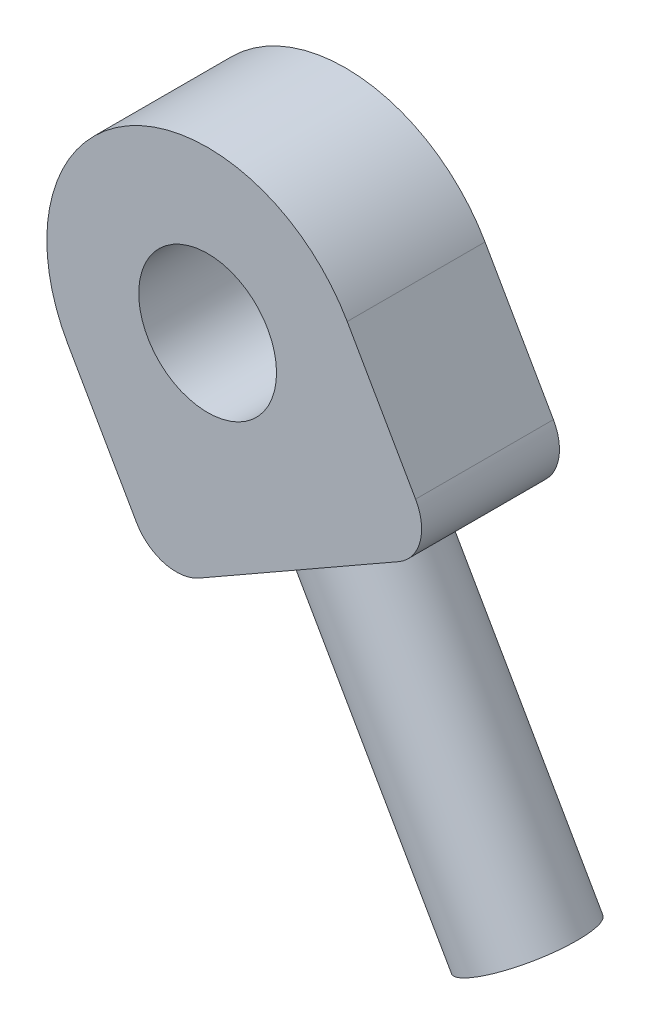
ISO-10303-21;
HEADER;
FILE_DESCRIPTION(('STEP AP214'),'2;1');
FILE_NAME('part.step','',(''),(''),'','','');
FILE_SCHEMA(('AUTOMOTIVE_DESIGN { 1 0 10303 214 1 1 1 1 }'));
ENDSEC;
DATA;
#1=APPLICATION_CONTEXT('core data for automotive mechanical design processes');
#2=APPLICATION_PROTOCOL_DEFINITION('international standard','automotive_design',2000,#1);
#3=PRODUCT_CONTEXT('',#1,'mechanical');
#4=PRODUCT('Part','Part','',(#3));
#5=PRODUCT_RELATED_PRODUCT_CATEGORY('part','',(#4));
#6=PRODUCT_DEFINITION_FORMATION('','',#4);
#7=PRODUCT_DEFINITION_CONTEXT('part definition',#1,'design');
#8=PRODUCT_DEFINITION('design','',#6,#7);
#9=PRODUCT_DEFINITION_SHAPE('','',#8);
#10=(LENGTH_UNIT() NAMED_UNIT(*) SI_UNIT(.MILLI.,.METRE.));
#11=(NAMED_UNIT(*) PLANE_ANGLE_UNIT() SI_UNIT($,.RADIAN.));
#12=(NAMED_UNIT(*) SI_UNIT($,.STERADIAN.) SOLID_ANGLE_UNIT());
#13=UNCERTAINTY_MEASURE_WITH_UNIT(LENGTH_MEASURE(1.E-05),#10,'distance_accuracy_value','');
#14=(GEOMETRIC_REPRESENTATION_CONTEXT(3) GLOBAL_UNCERTAINTY_ASSIGNED_CONTEXT((#13)) GLOBAL_UNIT_ASSIGNED_CONTEXT((#10,
#11,#12)) REPRESENTATION_CONTEXT('',''));
#15=CARTESIAN_POINT('',(0.,0.,0.));
#16=DIRECTION('',(0.,0.,1.));
#17=DIRECTION('',(1.,0.,0.));
#18=AXIS2_PLACEMENT_3D('',#15,#16,#17);
#19=CARTESIAN_POINT('',(20.,15.,3.));
#20=DIRECTION('',(0.,0.,1.));
#21=DIRECTION('',(1.,0.,0.));
#22=AXIS2_PLACEMENT_3D('',#19,#20,#21);
#23=PLANE('',#22);
#24=DIRECTION('',(0.496138938356834,-0.868243142124459,0.));
#25=VECTOR('',#24,1.);
#26=CARTESIAN_POINT('',(13.9222980051288,11.5270274315022,3.));
#27=LINE('',#26,#25);
#28=CARTESIAN_POINT('',(13.9222980051288,11.5270274315022,3.));
#29=VERTEX_POINT('',#28);
#30=CARTESIAN_POINT('',(16.8991316352698,6.31756857875541,3.));
#31=VERTEX_POINT('',#30);
#32=EDGE_CURVE('E92',#29,#31,#27,.T.);
#33=ORIENTED_EDGE('',*,*,#32,.T.);
#34=CARTESIAN_POINT('',(18.6356179195187,7.30984645546908,3.));
#35=DIRECTION('',(0.,0.,1.));
#36=DIRECTION('',(1.,0.,0.));
#37=AXIS2_PLACEMENT_3D('',#34,#35,#36);
#38=CIRCLE('',#37,2.);
#39=CARTESIAN_POINT('',(19.6278957962324,5.57336017122016,3.));
#40=VERTEX_POINT('',#39);
#41=EDGE_CURVE('E25',#31,#40,#38,.T.);
#42=ORIENTED_EDGE('',*,*,#41,.T.);
#43=DIRECTION('',(0.868243142124459,0.496138938356834,0.));
#44=VECTOR('',#43,1.);
#45=CARTESIAN_POINT('',(17.8914095119835,4.58108229450649,3.));
#46=LINE('',#45,#44);
#47=CARTESIAN_POINT('',(28.3103272174769,10.5347495547885,3.));
#48=VERTEX_POINT('',#47);
#49=EDGE_CURVE('E78',#40,#48,#46,.T.);
#50=ORIENTED_EDGE('',*,*,#49,.T.);
#51=CARTESIAN_POINT('',(27.3180493407633,12.2712358390374,3.));
#52=DIRECTION('',(0.,0.,1.));
#53=DIRECTION('',(1.,0.,0.));
#54=AXIS2_PLACEMENT_3D('',#51,#52,#53);
#55=CIRCLE('',#54,2.);
#56=CARTESIAN_POINT('',(29.0545356250122,13.2635137157511,3.));
#57=VERTEX_POINT('',#56);
#58=EDGE_CURVE('E32',#48,#57,#55,.T.);
#59=ORIENTED_EDGE('',*,*,#58,.T.);
#60=DIRECTION('',(-0.496138938356834,0.868243142124459,0.));
#61=VECTOR('',#60,1.);
#62=CARTESIAN_POINT('',(30.0468135017259,11.5270274315022,3.));
#63=LINE('',#62,#61);
#64=CARTESIAN_POINT('',(26.0777019948712,18.4729725684979,3.));
#65=VERTEX_POINT('',#64);
#66=EDGE_CURVE('E70',#57,#65,#63,.T.);
#67=ORIENTED_EDGE('',*,*,#66,.T.);
#68=CARTESIAN_POINT('',(20.,15.,3.));
#69=DIRECTION('',(0.,0.,1.));
#70=DIRECTION('',(1.,0.,0.));
#71=AXIS2_PLACEMENT_3D('',#68,#69,#70);
#72=CIRCLE('',#71,7.);
#73=EDGE_CURVE('E74',#65,#29,#72,.T.);
#74=ORIENTED_EDGE('',*,*,#73,.T.);
#75=EDGE_LOOP('',(#33,#42,#50,#59,#67,#74));
#76=FACE_BOUND('',#75,.T.);
#77=CARTESIAN_POINT('',(20.,15.,3.));
#78=DIRECTION('',(0.,0.,1.));
#79=DIRECTION('',(1.,0.,0.));
#80=AXIS2_PLACEMENT_3D('',#77,#78,#79);
#81=CIRCLE('',#80,3.);
#82=CARTESIAN_POINT('',(23.,15.,3.));
#83=VERTEX_POINT('',#82);
#84=EDGE_CURVE('E100',#83,#83,#81,.T.);
#85=ORIENTED_EDGE('',*,*,#84,.F.);
#86=EDGE_LOOP('',(#85));
#87=FACE_BOUND('',#86,.T.);
#88=ADVANCED_FACE('F17',(#76,#87),#23,.T.);
#89=CARTESIAN_POINT('',(20.,15.,-3.));
#90=DIRECTION('',(0.,0.,1.));
#91=DIRECTION('',(1.,0.,0.));
#92=AXIS2_PLACEMENT_3D('',#89,#90,#91);
#93=PLANE('',#92);
#94=DIRECTION('',(0.868243142124459,0.496138938356834,0.));
#95=VECTOR('',#94,1.);
#96=CARTESIAN_POINT('',(17.8914095119835,4.58108229450649,-3.));
#97=LINE('',#96,#95);
#98=CARTESIAN_POINT('',(19.6278957962324,5.57336017122016,-3.));
#99=VERTEX_POINT('',#98);
#100=CARTESIAN_POINT('',(28.3103272174769,10.5347495547885,-3.));
#101=VERTEX_POINT('',#100);
#102=EDGE_CURVE('E97',#99,#101,#97,.T.);
#103=ORIENTED_EDGE('',*,*,#102,.F.);
#104=CARTESIAN_POINT('',(18.6356179195187,7.30984645546908,-3.));
#105=DIRECTION('',(0.,0.,1.));
#106=DIRECTION('',(1.,0.,0.));
#107=AXIS2_PLACEMENT_3D('',#104,#105,#106);
#108=CIRCLE('',#107,2.);
#109=CARTESIAN_POINT('',(16.8991316352698,6.31756857875541,-3.));
#110=VERTEX_POINT('',#109);
#111=EDGE_CURVE('E114',#99,#110,#108,.F.);
#112=ORIENTED_EDGE('',*,*,#111,.T.);
#113=DIRECTION('',(0.496138938356834,-0.868243142124459,0.));
#114=VECTOR('',#113,1.);
#115=CARTESIAN_POINT('',(13.9222980051288,11.5270274315022,-3.));
#116=LINE('',#115,#114);
#117=CARTESIAN_POINT('',(13.9222980051288,11.5270274315022,-3.));
#118=VERTEX_POINT('',#117);
#119=EDGE_CURVE('E104',#118,#110,#116,.T.);
#120=ORIENTED_EDGE('',*,*,#119,.F.);
#121=CARTESIAN_POINT('',(20.,15.,-3.));
#122=DIRECTION('',(0.,0.,1.));
#123=DIRECTION('',(1.,0.,0.));
#124=AXIS2_PLACEMENT_3D('',#121,#122,#123);
#125=CIRCLE('',#124,7.);
#126=CARTESIAN_POINT('',(26.0777019948712,18.4729725684979,-3.));
#127=VERTEX_POINT('',#126);
#128=EDGE_CURVE('E102',#127,#118,#125,.T.);
#129=ORIENTED_EDGE('',*,*,#128,.F.);
#130=DIRECTION('',(-0.496138938356834,0.868243142124459,0.));
#131=VECTOR('',#130,1.);
#132=CARTESIAN_POINT('',(30.0468135017259,11.5270274315022,-3.));
#133=LINE('',#132,#131);
#134=CARTESIAN_POINT('',(29.0545356250122,13.2635137157511,-3.));
#135=VERTEX_POINT('',#134);
#136=EDGE_CURVE('E84',#135,#127,#133,.T.);
#137=ORIENTED_EDGE('',*,*,#136,.F.);
#138=CARTESIAN_POINT('',(27.3180493407633,12.2712358390374,-3.));
#139=DIRECTION('',(0.,0.,1.));
#140=DIRECTION('',(1.,0.,0.));
#141=AXIS2_PLACEMENT_3D('',#138,#139,#140);
#142=CIRCLE('',#141,2.);
#143=EDGE_CURVE('E112',#135,#101,#142,.F.);
#144=ORIENTED_EDGE('',*,*,#143,.T.);
#145=EDGE_LOOP('',(#103,#112,#120,#129,#137,#144));
#146=FACE_BOUND('',#145,.T.);
#147=CARTESIAN_POINT('',(20.,15.,-3.));
#148=DIRECTION('',(0.,0.,1.));
#149=DIRECTION('',(1.,0.,0.));
#150=AXIS2_PLACEMENT_3D('',#147,#148,#149);
#151=CIRCLE('',#150,3.);
#152=CARTESIAN_POINT('',(23.,15.,-3.));
#153=VERTEX_POINT('',#152);
#154=EDGE_CURVE('E162',#153,#153,#151,.T.);
#155=ORIENTED_EDGE('',*,*,#154,.T.);
#156=EDGE_LOOP('',(#155));
#157=FACE_BOUND('',#156,.T.);
#158=ADVANCED_FACE('F128',(#146,#157),#93,.F.);
#159=CARTESIAN_POINT('',(17.8914095119835,4.58108229450649,3.));
#160=DIRECTION('',(-0.496138938356834,0.868243142124459,0.));
#161=DIRECTION('',(-0.868243142124459,-0.496138938356834,0.));
#162=AXIS2_PLACEMENT_3D('',#159,#160,#161);
#163=PLANE('',#162);
#164=CARTESIAN_POINT('',(23.9691115068547,8.05405486300433,0.));
#165=DIRECTION('',(0.496138938356834,-0.868243142124459,0.));
#166=DIRECTION('',(0.868243142124459,0.496138938356834,0.));
#167=AXIS2_PLACEMENT_3D('',#164,#165,#166);
#168=CIRCLE('',#167,2.5);
#169=CARTESIAN_POINT('',(21.7985036515435,6.81370751711223,0.));
#170=VERTEX_POINT('',#169);
#171=EDGE_CURVE('E87',#170,#170,#168,.T.);
#172=ORIENTED_EDGE('',*,*,#171,.F.);
#173=EDGE_LOOP('',(#172));
#174=FACE_BOUND('',#173,.T.);
#175=ORIENTED_EDGE('',*,*,#49,.F.);
#176=DIRECTION('',(0.,0.,-1.));
#177=VECTOR('',#176,1.);
#178=CARTESIAN_POINT('',(19.6278957962324,5.57336017122016,3.));
#179=LINE('',#178,#177);
#180=EDGE_CURVE('E109',#40,#99,#179,.T.);
#181=ORIENTED_EDGE('',*,*,#180,.T.);
#182=ORIENTED_EDGE('',*,*,#102,.T.);
#183=DIRECTION('',(0.,0.,-1.));
#184=VECTOR('',#183,1.);
#185=CARTESIAN_POINT('',(28.3103272174769,10.5347495547885,3.));
#186=LINE('',#185,#184);
#187=EDGE_CURVE('E107',#101,#48,#186,.F.);
#188=ORIENTED_EDGE('',*,*,#187,.T.);
#189=EDGE_LOOP('',(#175,#181,#182,#188));
#190=FACE_BOUND('',#189,.T.);
#191=ADVANCED_FACE('F122',(#174,#190),#163,.F.);
#192=CARTESIAN_POINT('',(30.0468135017259,11.5270274315022,3.));
#193=DIRECTION('',(-0.868243142124459,-0.496138938356834,0.));
#194=DIRECTION('',(0.496138938356834,-0.868243142124459,0.));
#195=AXIS2_PLACEMENT_3D('',#192,#193,#194);
#196=PLANE('',#195);
#197=ORIENTED_EDGE('',*,*,#66,.F.);
#198=DIRECTION('',(0.,0.,-1.));
#199=VECTOR('',#198,1.);
#200=CARTESIAN_POINT('',(29.0545356250122,13.2635137157511,3.));
#201=LINE('',#200,#199);
#202=EDGE_CURVE('E11',#57,#135,#201,.T.);
#203=ORIENTED_EDGE('',*,*,#202,.T.);
#204=ORIENTED_EDGE('',*,*,#136,.T.);
#205=DIRECTION('',(0.,0.,-1.));
#206=VECTOR('',#205,1.);
#207=CARTESIAN_POINT('',(26.0777019948712,18.4729725684979,3.));
#208=LINE('',#207,#206);
#209=EDGE_CURVE('E81',#65,#127,#208,.T.);
#210=ORIENTED_EDGE('',*,*,#209,.F.);
#211=EDGE_LOOP('',(#197,#203,#204,#210));
#212=FACE_BOUND('',#211,.T.);
#213=ADVANCED_FACE('F82',(#212),#196,.F.);
#214=CARTESIAN_POINT('',(20.,15.,3.));
#215=DIRECTION('',(0.,0.,-1.));
#216=DIRECTION('',(-1.,0.,0.));
#217=AXIS2_PLACEMENT_3D('',#214,#215,#216);
#218=CYLINDRICAL_SURFACE('',#217,7.);
#219=ORIENTED_EDGE('',*,*,#128,.T.);
#220=DIRECTION('',(0.,0.,-1.));
#221=VECTOR('',#220,1.);
#222=CARTESIAN_POINT('',(13.9222980051288,11.5270274315022,3.));
#223=LINE('',#222,#221);
#224=EDGE_CURVE('E88',#29,#118,#223,.T.);
#225=ORIENTED_EDGE('',*,*,#224,.F.);
#226=ORIENTED_EDGE('',*,*,#73,.F.);
#227=ORIENTED_EDGE('',*,*,#209,.T.);
#228=EDGE_LOOP('',(#219,#225,#226,#227));
#229=FACE_BOUND('',#228,.T.);
#230=ADVANCED_FACE('F90',(#229),#218,.T.);
#231=CARTESIAN_POINT('',(13.9222980051288,11.5270274315022,3.));
#232=DIRECTION('',(0.868243142124459,0.496138938356834,0.));
#233=DIRECTION('',(-0.496138938356834,0.868243142124459,0.));
#234=AXIS2_PLACEMENT_3D('',#231,#232,#233);
#235=PLANE('',#234);
#236=ORIENTED_EDGE('',*,*,#119,.T.);
#237=DIRECTION('',(0.,0.,-1.));
#238=VECTOR('',#237,1.);
#239=CARTESIAN_POINT('',(16.8991316352698,6.31756857875541,3.));
#240=LINE('',#239,#238);
#241=EDGE_CURVE('E40',#110,#31,#240,.F.);
#242=ORIENTED_EDGE('',*,*,#241,.T.);
#243=ORIENTED_EDGE('',*,*,#32,.F.);
#244=ORIENTED_EDGE('',*,*,#224,.T.);
#245=EDGE_LOOP('',(#236,#242,#243,#244));
#246=FACE_BOUND('',#245,.T.);
#247=ADVANCED_FACE('F130',(#246),#235,.F.);
#248=CARTESIAN_POINT('',(20.,15.,3.));
#249=DIRECTION('',(0.,0.,-1.));
#250=DIRECTION('',(-1.,0.,0.));
#251=AXIS2_PLACEMENT_3D('',#248,#249,#250);
#252=CYLINDRICAL_SURFACE('',#251,3.);
#253=ORIENTED_EDGE('',*,*,#84,.T.);
#254=EDGE_LOOP('',(#253));
#255=FACE_BOUND('',#254,.T.);
#256=ORIENTED_EDGE('',*,*,#154,.F.);
#257=EDGE_LOOP('',(#256));
#258=FACE_BOUND('',#257,.T.);
#259=ADVANCED_FACE('F132',(#255,#258),#252,.F.);
#260=CARTESIAN_POINT('',(30.9150566438504,-4.1013491267381,0.));
#261=DIRECTION('',(-0.496138938356834,0.868243142124459,0.));
#262=DIRECTION('',(-0.868243142124459,-0.496138938356834,0.));
#263=AXIS2_PLACEMENT_3D('',#260,#261,#262);
#264=CYLINDRICAL_SURFACE('',#263,2.5);
#265=CARTESIAN_POINT('',(30.9150566438504,-4.1013491267381,0.));
#266=DIRECTION('',(0.496138938356834,-0.868243142124459,0.));
#267=DIRECTION('',(0.868243142124459,0.496138938356834,0.));
#268=AXIS2_PLACEMENT_3D('',#265,#266,#267);
#269=CIRCLE('',#268,2.5);
#270=CARTESIAN_POINT('',(28.7444487885392,-5.34169647263018,0.));
#271=VERTEX_POINT('',#270);
#272=EDGE_CURVE('E161',#271,#271,#269,.T.);
#273=CARTESIAN_POINT('',(28.7444487885392,-5.34169647263018,0.));
#274=CARTESIAN_POINT('',(28.6720951933622,-5.21507768107036,0.));
#275=CARTESIAN_POINT('',(28.5997415981851,-5.08845888951054,0.));
#276=CARTESIAN_POINT('',(28.4550344078311,-4.83522130639091,0.));
#277=CARTESIAN_POINT('',(28.382680812654,-4.7086025148311,0.));
#278=CARTESIAN_POINT('',(28.2379736222999,-4.45536493171146,0.));
#279=CARTESIAN_POINT('',(28.1656200271229,-4.32874614015164,0.));
#280=CARTESIAN_POINT('',(28.0209128367688,-4.07550855703201,0.));
#281=CARTESIAN_POINT('',(27.9485592415918,-3.94888976547219,0.));
#282=CARTESIAN_POINT('',(27.8038520512377,-3.69565218235256,0.));
#283=CARTESIAN_POINT('',(27.7314984560607,-3.56903339079274,0.));
#284=CARTESIAN_POINT('',(27.5867912657066,-3.31579580767311,0.));
#285=CARTESIAN_POINT('',(27.5144376705296,-3.18917701611329,0.));
#286=CARTESIAN_POINT('',(27.3697304801755,-2.93593943299366,0.));
#287=CARTESIAN_POINT('',(27.2973768849984,-2.80932064143384,0.));
#288=CARTESIAN_POINT('',(27.1526696946444,-2.55608305831421,0.));
#289=CARTESIAN_POINT('',(27.0803160994673,-2.42946426675439,0.));
#290=CARTESIAN_POINT('',(26.9356089091132,-2.17622668363476,0.));
#291=CARTESIAN_POINT('',(26.8632553139362,-2.04960789207494,0.));
#292=CARTESIAN_POINT('',(26.7185481235821,-1.79637030895531,0.));
#293=CARTESIAN_POINT('',(26.6461945284051,-1.66975151739549,0.));
#294=CARTESIAN_POINT('',(26.501487338051,-1.41651393427586,0.));
#295=CARTESIAN_POINT('',(26.429133742874,-1.28989514271604,0.));
#296=CARTESIAN_POINT('',(26.2844265525199,-1.03665755959641,0.));
#297=CARTESIAN_POINT('',(26.2120729573429,-0.910038768036591,0.));
#298=CARTESIAN_POINT('',(26.0673657669888,-0.656801184916957,0.));
#299=CARTESIAN_POINT('',(25.9950121718118,-0.530182393357141,0.));
#300=CARTESIAN_POINT('',(25.8503049814577,-0.276944810237507,0.));
#301=CARTESIAN_POINT('',(25.7779513862806,-0.15032601867769,0.));
#302=CARTESIAN_POINT('',(25.6332441959266,0.102911564441944,0.));
#303=CARTESIAN_POINT('',(25.5608906007495,0.229530356001761,0.));
#304=CARTESIAN_POINT('',(25.4161834103954,0.482767939121395,0.));
#305=CARTESIAN_POINT('',(25.3438298152184,0.609386730681211,0.));
#306=CARTESIAN_POINT('',(25.1991226248643,0.862624313800844,0.));
#307=CARTESIAN_POINT('',(25.1267690296873,0.989243105360661,0.));
#308=CARTESIAN_POINT('',(24.9820618393332,1.2424806884803,0.));
#309=CARTESIAN_POINT('',(24.9097082441562,1.36909948004011,0.));
#310=CARTESIAN_POINT('',(24.7650010538021,1.62233706315975,0.));
#311=CARTESIAN_POINT('',(24.6926474586251,1.74895585471956,0.));
#312=CARTESIAN_POINT('',(24.547940268271,2.0021934378392,0.));
#313=CARTESIAN_POINT('',(24.475586673094,2.12881222939901,0.));
#314=CARTESIAN_POINT('',(24.3308794827399,2.38204981251865,0.));
#315=CARTESIAN_POINT('',(24.2585258875628,2.50866860407846,0.));
#316=CARTESIAN_POINT('',(24.1138186972088,2.7619061871981,0.));
#317=CARTESIAN_POINT('',(24.0414651020317,2.88852497875791,0.));
#318=CARTESIAN_POINT('',(23.8967579116776,3.14176256187755,0.));
#319=CARTESIAN_POINT('',(23.8244043165006,3.26838135343736,0.));
#320=CARTESIAN_POINT('',(23.6796971261465,3.521618936557,0.));
#321=CARTESIAN_POINT('',(23.6073435309695,3.64823772811681,0.));
#322=CARTESIAN_POINT('',(23.4626363406154,3.90147531123645,0.));
#323=CARTESIAN_POINT('',(23.3902827454384,4.02809410279627,0.));
#324=CARTESIAN_POINT('',(23.2455755550843,4.2813316859159,0.));
#325=CARTESIAN_POINT('',(23.1732219599073,4.40795047747572,0.));
#326=CARTESIAN_POINT('',(23.0285147695532,4.66118806059535,0.));
#327=CARTESIAN_POINT('',(22.9561611743761,4.78780685215517,0.));
#328=CARTESIAN_POINT('',(22.8114539840221,5.0410444352748,0.));
#329=CARTESIAN_POINT('',(22.739100388845,5.16766322683462,0.));
#330=CARTESIAN_POINT('',(22.594393198491,5.42090080995425,0.));
#331=CARTESIAN_POINT('',(22.5220396033139,5.54751960151407,0.));
#332=CARTESIAN_POINT('',(22.3773324129598,5.8007571846337,0.));
#333=CARTESIAN_POINT('',(22.3049788177828,5.92737597619352,0.));
#334=CARTESIAN_POINT('',(22.1602716274287,6.18061355931315,0.));
#335=CARTESIAN_POINT('',(22.0879180322517,6.30723235087297,0.));
#336=CARTESIAN_POINT('',(21.9432108418976,6.5604699339926,0.));
#337=CARTESIAN_POINT('',(21.8708572467206,6.68708872555242,0.));
#338=CARTESIAN_POINT('',(21.7985036515435,6.81370751711223,0.));
#339=B_SPLINE_CURVE_WITH_KNOTS('',3,(#273,#274,#275,#276,#277,#278,#279,#280,#281,#282,#283,
#284,#285,#286,#287,#288,#289,#290,#291,#292,#293,#294,#295,#296,#297,#298,#299,#300,#301,#302,
#303,#304,#305,#306,#307,#308,#309,#310,#311,#312,#313,#314,#315,#316,#317,#318,#319,#320,#321,
#322,#323,#324,#325,#326,#327,#328,#329,#330,#331,#332,#333,#334,#335,#336,#337,#338),
.UNSPECIFIED.,.F.,.F.,(4,2,2,2,2,2,2,2,2,2,2,2,2,2,2,2,2,2,2,2,2,2,2,2,2,2,2,2,2,2,2,2,4),(0.,
0.437499999999999,0.875,1.3125,1.75,2.1875,2.625,3.0625,3.5,3.9375,4.375,4.8125,
5.24999999999999,5.68749999999999,6.12499999999999,6.56249999999999,6.99999999999999,
7.43749999999999,7.87499999999999,8.31249999999999,8.74999999999999,9.18749999999999,
9.62499999999999,10.0625,10.5,10.9375,11.375,11.8125,12.25,12.6875,13.125,13.5625,14.),.UNSPECIFIED.);
#340=EDGE_CURVE('BSEAM139',#271,#170,#339,.T.);
#341=ORIENTED_EDGE('',*,*,#272,.F.);
#342=ORIENTED_EDGE('',*,*,#171,.T.);
#343=ORIENTED_EDGE('',*,*,#340,.T.);
#344=ORIENTED_EDGE('',*,*,#340,.F.);
#345=EDGE_LOOP('',(#341,#343,#342,#344));
#346=FACE_BOUND('',#345,.T.);
#347=ADVANCED_FACE('F139',(#346),#264,.T.);
#348=CARTESIAN_POINT('',(30.9150566438504,-4.1013491267381,0.));
#349=DIRECTION('',(0.496138938356834,-0.868243142124459,0.));
#350=DIRECTION('',(0.868243142124459,0.496138938356834,0.));
#351=AXIS2_PLACEMENT_3D('',#348,#349,#350);
#352=PLANE('',#351);
#353=ORIENTED_EDGE('',*,*,#272,.T.);
#354=EDGE_LOOP('',(#353));
#355=FACE_BOUND('',#354,.T.);
#356=ADVANCED_FACE('F152',(#355),#352,.T.);
#357=CARTESIAN_POINT('',(18.6356179195187,7.30984645546908,3.));
#358=DIRECTION('',(0.,0.,-1.));
#359=DIRECTION('',(-1.,0.,0.));
#360=AXIS2_PLACEMENT_3D('',#357,#358,#359);
#361=CYLINDRICAL_SURFACE('',#360,2.);
#362=ORIENTED_EDGE('',*,*,#41,.F.);
#363=ORIENTED_EDGE('',*,*,#241,.F.);
#364=ORIENTED_EDGE('',*,*,#111,.F.);
#365=ORIENTED_EDGE('',*,*,#180,.F.);
#366=EDGE_LOOP('',(#362,#363,#364,#365));
#367=FACE_BOUND('',#366,.T.);
#368=ADVANCED_FACE('F125',(#367),#361,.T.);
#369=CARTESIAN_POINT('',(27.3180493407633,12.2712358390374,3.));
#370=DIRECTION('',(0.,0.,-1.));
#371=DIRECTION('',(-1.,0.,0.));
#372=AXIS2_PLACEMENT_3D('',#369,#370,#371);
#373=CYLINDRICAL_SURFACE('',#372,2.);
#374=ORIENTED_EDGE('',*,*,#58,.F.);
#375=ORIENTED_EDGE('',*,*,#187,.F.);
#376=ORIENTED_EDGE('',*,*,#143,.F.);
#377=ORIENTED_EDGE('',*,*,#202,.F.);
#378=EDGE_LOOP('',(#374,#375,#376,#377));
#379=FACE_BOUND('',#378,.T.);
#380=ADVANCED_FACE('F19',(#379),#373,.T.);
#381=CLOSED_SHELL('',(#88,#158,#191,#213,#230,#247,#259,#347,#356,#368,#380));
#382=MANIFOLD_SOLID_BREP('B1',#381);
#383=ADVANCED_BREP_SHAPE_REPRESENTATION('',(#18,#382),#14);
#384=SHAPE_DEFINITION_REPRESENTATION(#9,#383);
ENDSEC;
END-ISO-10303-21;
